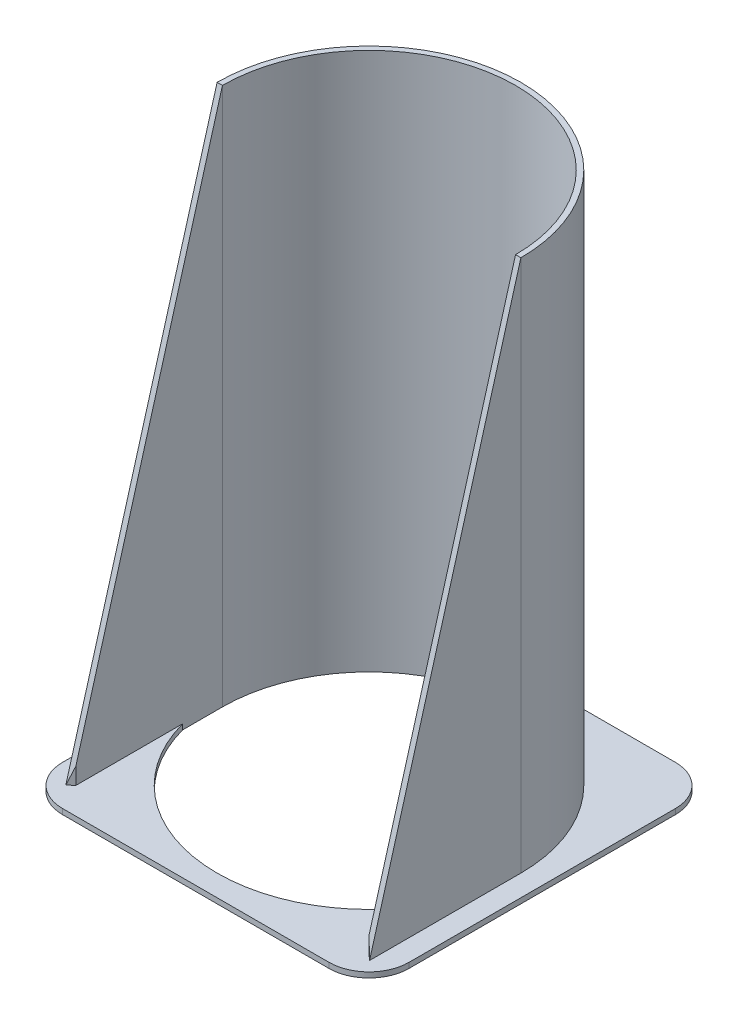
ISO-10303-21;
HEADER;
FILE_DESCRIPTION(('STEP AP214'),'2;1');
FILE_NAME('part.step','',(''),(''),'','','');
FILE_SCHEMA(('AUTOMOTIVE_DESIGN { 1 0 10303 214 1 1 1 1 }'));
ENDSEC;
DATA;
#1=APPLICATION_CONTEXT('core data for automotive mechanical design processes');
#2=APPLICATION_PROTOCOL_DEFINITION('international standard','automotive_design',2000,#1);
#3=PRODUCT_CONTEXT('',#1,'mechanical');
#4=PRODUCT('Part','Part','',(#3));
#5=PRODUCT_RELATED_PRODUCT_CATEGORY('part','',(#4));
#6=PRODUCT_DEFINITION_FORMATION('','',#4);
#7=PRODUCT_DEFINITION_CONTEXT('part definition',#1,'design');
#8=PRODUCT_DEFINITION('design','',#6,#7);
#9=PRODUCT_DEFINITION_SHAPE('','',#8);
#10=(LENGTH_UNIT() NAMED_UNIT(*) SI_UNIT(.MILLI.,.METRE.));
#11=(NAMED_UNIT(*) PLANE_ANGLE_UNIT() SI_UNIT($,.RADIAN.));
#12=(NAMED_UNIT(*) SI_UNIT($,.STERADIAN.) SOLID_ANGLE_UNIT());
#13=UNCERTAINTY_MEASURE_WITH_UNIT(LENGTH_MEASURE(1.E-05),#10,'distance_accuracy_value','');
#14=(GEOMETRIC_REPRESENTATION_CONTEXT(3) GLOBAL_UNCERTAINTY_ASSIGNED_CONTEXT((#13)) GLOBAL_UNIT_ASSIGNED_CONTEXT((#10,
#11,#12)) REPRESENTATION_CONTEXT('',''));
#15=CARTESIAN_POINT('',(0.,0.,0.));
#16=DIRECTION('',(0.,0.,1.));
#17=DIRECTION('',(1.,0.,0.));
#18=AXIS2_PLACEMENT_3D('',#15,#16,#17);
#19=CARTESIAN_POINT('',(47.5,1.,0.));
#20=DIRECTION('',(1.,0.,0.));
#21=DIRECTION('',(0.,0.,-1.));
#22=AXIS2_PLACEMENT_3D('',#19,#20,#21);
#23=PLANE('',#22);
#24=DIRECTION('',(0.,-1.,0.));
#25=VECTOR('',#24,1.);
#26=CARTESIAN_POINT('',(47.5,1.,-75.));
#27=LINE('',#26,#25);
#28=CARTESIAN_POINT('',(47.5,101.,-75.));
#29=VERTEX_POINT('',#28);
#30=CARTESIAN_POINT('',(47.5,0.,-75.));
#31=VERTEX_POINT('',#30);
#32=EDGE_CURVE('E250',#29,#31,#27,.T.);
#33=ORIENTED_EDGE('',*,*,#32,.F.);
#34=DIRECTION('',(0.,-0.961979500729469,0.273121658197005));
#35=VECTOR('',#34,1.);
#36=CARTESIAN_POINT('',(47.5,-11.2457637116788,-43.1315983477029));
#37=LINE('',#36,#35);
#38=CARTESIAN_POINT('',(47.5,4.14046698201226,-47.5));
#39=VERTEX_POINT('',#38);
#40=EDGE_CURVE('E174',#29,#39,#37,.T.);
#41=ORIENTED_EDGE('',*,*,#40,.T.);
#42=DIRECTION('',(0.,-1.,0.));
#43=VECTOR('',#42,1.);
#44=CARTESIAN_POINT('',(47.5,101.,-47.5));
#45=LINE('',#44,#43);
#46=CARTESIAN_POINT('',(47.5,1.,-47.5));
#47=VERTEX_POINT('',#46);
#48=EDGE_CURVE('E173',#39,#47,#45,.T.);
#49=ORIENTED_EDGE('',*,*,#48,.T.);
#50=DIRECTION('',(0.,0.,-1.));
#51=VECTOR('',#50,1.);
#52=CARTESIAN_POINT('',(47.5,1.,0.));
#53=LINE('',#52,#51);
#54=CARTESIAN_POINT('',(47.5,1.,-67.5166852264521));
#55=VERTEX_POINT('',#54);
#56=EDGE_CURVE('E184',#47,#55,#53,.T.);
#57=ORIENTED_EDGE('',*,*,#56,.T.);
#58=DIRECTION('',(0.,-1.,0.));
#59=VECTOR('',#58,1.);
#60=CARTESIAN_POINT('',(47.5,1.,-67.5166852264521));
#61=LINE('',#60,#59);
#62=CARTESIAN_POINT('',(47.5,0.,-67.5166852264521));
#63=VERTEX_POINT('',#62);
#64=EDGE_CURVE('E252',#55,#63,#61,.T.);
#65=ORIENTED_EDGE('',*,*,#64,.T.);
#66=DIRECTION('',(0.,0.,1.));
#67=VECTOR('',#66,1.);
#68=CARTESIAN_POINT('',(47.5,0.,0.));
#69=LINE('',#68,#67);
#70=EDGE_CURVE('E227',#31,#63,#69,.T.);
#71=ORIENTED_EDGE('',*,*,#70,.F.);
#72=EDGE_LOOP('',(#33,#41,#49,#57,#65,#71));
#73=FACE_BOUND('',#72,.T.);
#74=ADVANCED_FACE('F35',(#73),#23,.T.);
#75=CARTESIAN_POINT('',(102.5,1.,0.));
#76=DIRECTION('',(1.,0.,0.));
#77=DIRECTION('',(0.,0.,-1.));
#78=AXIS2_PLACEMENT_3D('',#75,#76,#77);
#79=PLANE('',#78);
#80=DIRECTION('',(0.,-0.961979500729469,0.273121658197005));
#81=VECTOR('',#80,1.);
#82=CARTESIAN_POINT('',(102.5,-11.2457637116788,-43.1315983477029));
#83=LINE('',#82,#81);
#84=CARTESIAN_POINT('',(102.5,101.,-75.));
#85=VERTEX_POINT('',#84);
#86=CARTESIAN_POINT('',(102.5,4.14046698201226,-47.5));
#87=VERTEX_POINT('',#86);
#88=EDGE_CURVE('E542',#85,#87,#83,.T.);
#89=ORIENTED_EDGE('',*,*,#88,.F.);
#90=DIRECTION('',(0.,-1.,0.));
#91=VECTOR('',#90,1.);
#92=CARTESIAN_POINT('',(102.5,1.,-75.));
#93=LINE('',#92,#91);
#94=CARTESIAN_POINT('',(102.5,0.,-75.));
#95=VERTEX_POINT('',#94);
#96=EDGE_CURVE('E248',#85,#95,#93,.T.);
#97=ORIENTED_EDGE('',*,*,#96,.T.);
#98=DIRECTION('',(0.,0.,1.));
#99=VECTOR('',#98,1.);
#100=CARTESIAN_POINT('',(102.5,0.,0.));
#101=LINE('',#100,#99);
#102=CARTESIAN_POINT('',(102.5,0.,-67.5166852264521));
#103=VERTEX_POINT('',#102);
#104=EDGE_CURVE('E233',#95,#103,#101,.T.);
#105=ORIENTED_EDGE('',*,*,#104,.T.);
#106=DIRECTION('',(0.,-1.,0.));
#107=VECTOR('',#106,1.);
#108=CARTESIAN_POINT('',(102.5,1.,-67.5166852264521));
#109=LINE('',#108,#107);
#110=CARTESIAN_POINT('',(102.5,1.,-67.5166852264521));
#111=VERTEX_POINT('',#110);
#112=EDGE_CURVE('E224',#111,#103,#109,.T.);
#113=ORIENTED_EDGE('',*,*,#112,.F.);
#114=DIRECTION('',(0.,0.,-1.));
#115=VECTOR('',#114,1.);
#116=CARTESIAN_POINT('',(102.5,1.,0.));
#117=LINE('',#116,#115);
#118=CARTESIAN_POINT('',(102.5,1.,-47.5));
#119=VERTEX_POINT('',#118);
#120=EDGE_CURVE('E552',#119,#111,#117,.T.);
#121=ORIENTED_EDGE('',*,*,#120,.F.);
#122=DIRECTION('',(0.,-1.,0.));
#123=VECTOR('',#122,1.);
#124=CARTESIAN_POINT('',(102.5,101.,-47.5));
#125=LINE('',#124,#123);
#126=EDGE_CURVE('E202',#87,#119,#125,.T.);
#127=ORIENTED_EDGE('',*,*,#126,.F.);
#128=EDGE_LOOP('',(#89,#97,#105,#113,#121,#127));
#129=FACE_BOUND('',#128,.T.);
#130=ADVANCED_FACE('F321',(#129),#79,.F.);
#131=CARTESIAN_POINT('',(68.9916629566608,101.,-77.3770304560326));
#132=DIRECTION('',(0.665505868663793,0.,-0.746392617041494));
#133=DIRECTION('',(-0.746392617041494,0.,-0.665505868663793));
#134=AXIS2_PLACEMENT_3D('',#131,#132,#133);
#135=PLANE('',#134);
#136=DIRECTION('',(0.292884648100951,-0.919794566899323,0.261144667970204));
#137=VECTOR('',#136,1.);
#138=CARTESIAN_POINT('',(71.2471060367351,102.289148565977,-75.3660102878854));
#139=LINE('',#138,#137);
#140=CARTESIAN_POINT('',(103.5,1.,-46.6083702417882));
#141=VERTEX_POINT('',#140);
#142=EDGE_CURVE('E553',#87,#141,#139,.T.);
#143=ORIENTED_EDGE('',*,*,#142,.F.);
#144=ORIENTED_EDGE('',*,*,#126,.T.);
#145=DIRECTION('',(0.746392617041494,0.,0.665505868663793));
#146=VECTOR('',#145,1.);
#147=CARTESIAN_POINT('',(68.9916629566608,1.,-77.3770304560326));
#148=LINE('',#147,#146);
#149=EDGE_CURVE('E198',#119,#141,#148,.T.);
#150=ORIENTED_EDGE('',*,*,#149,.T.);
#151=EDGE_LOOP('',(#143,#144,#150));
#152=FACE_BOUND('',#151,.T.);
#153=ADVANCED_FACE('F327',(#152),#135,.F.);
#154=CARTESIAN_POINT('',(103.5,101.,0.));
#155=DIRECTION('',(-1.,0.,0.));
#156=DIRECTION('',(0.,0.,1.));
#157=AXIS2_PLACEMENT_3D('',#154,#155,#156);
#158=PLANE('',#157);
#159=DIRECTION('',(0.,-0.961979500729469,0.273121658197005));
#160=VECTOR('',#159,1.);
#161=CARTESIAN_POINT('',(103.5,-12.1711682715025,-42.8688609113121));
#162=LINE('',#161,#160);
#163=CARTESIAN_POINT('',(103.5,101.,-75.));
#164=VERTEX_POINT('',#163);
#165=EDGE_CURVE('E175',#164,#141,#162,.T.);
#166=ORIENTED_EDGE('',*,*,#165,.T.);
#167=DIRECTION('',(0.,0.,-1.));
#168=VECTOR('',#167,1.);
#169=CARTESIAN_POINT('',(103.5,1.,0.));
#170=LINE('',#169,#168);
#171=CARTESIAN_POINT('',(103.5,1.,-75.));
#172=VERTEX_POINT('',#171);
#173=EDGE_CURVE('E192',#141,#172,#170,.T.);
#174=ORIENTED_EDGE('',*,*,#173,.T.);
#175=DIRECTION('',(0.,-1.,0.));
#176=VECTOR('',#175,1.);
#177=CARTESIAN_POINT('',(103.5,101.,-75.));
#178=LINE('',#177,#176);
#179=EDGE_CURVE('E205',#164,#172,#178,.T.);
#180=ORIENTED_EDGE('',*,*,#179,.F.);
#181=EDGE_LOOP('',(#166,#174,#180));
#182=FACE_BOUND('',#181,.T.);
#183=ADVANCED_FACE('F401',(#182),#158,.F.);
#184=CARTESIAN_POINT('',(46.5,101.,0.));
#185=DIRECTION('',(-1.,0.,0.));
#186=DIRECTION('',(0.,0.,1.));
#187=AXIS2_PLACEMENT_3D('',#184,#185,#186);
#188=PLANE('',#187);
#189=DIRECTION('',(0.,0.,-1.));
#190=VECTOR('',#189,1.);
#191=CARTESIAN_POINT('',(46.5,1.,0.));
#192=LINE('',#191,#190);
#193=CARTESIAN_POINT('',(46.5,1.,-46.6083702417882));
#194=VERTEX_POINT('',#193);
#195=CARTESIAN_POINT('',(46.5,1.,-75.));
#196=VERTEX_POINT('',#195);
#197=EDGE_CURVE('E181',#194,#196,#192,.T.);
#198=ORIENTED_EDGE('',*,*,#197,.F.);
#199=DIRECTION('',(0.,0.961979500729469,-0.273121658197005));
#200=VECTOR('',#199,1.);
#201=CARTESIAN_POINT('',(46.5,-12.1711682715025,-42.8688609113121));
#202=LINE('',#201,#200);
#203=CARTESIAN_POINT('',(46.5,101.,-75.));
#204=VERTEX_POINT('',#203);
#205=EDGE_CURVE('E154',#194,#204,#202,.T.);
#206=ORIENTED_EDGE('',*,*,#205,.T.);
#207=DIRECTION('',(0.,-1.,0.));
#208=VECTOR('',#207,1.);
#209=CARTESIAN_POINT('',(46.5,101.,-75.));
#210=LINE('',#209,#208);
#211=EDGE_CURVE('E188',#204,#196,#210,.T.);
#212=ORIENTED_EDGE('',*,*,#211,.T.);
#213=EDGE_LOOP('',(#198,#206,#212));
#214=FACE_BOUND('',#213,.T.);
#215=ADVANCED_FACE('F186',(#214),#188,.T.);
#216=CARTESIAN_POINT('',(-2.55695377276836,101.,-2.86773041076645));
#217=DIRECTION('',(0.665505868663793,0.,0.746392617041494));
#218=DIRECTION('',(0.746392617041494,0.,-0.665505868663793));
#219=AXIS2_PLACEMENT_3D('',#216,#217,#218);
#220=PLANE('',#219);
#221=ORIENTED_EDGE('',*,*,#48,.F.);
#222=DIRECTION('',(-0.292884648100951,-0.919794566899323,0.261144667970204));
#223=VECTOR('',#222,1.);
#224=CARTESIAN_POINT('',(65.8856813992822,61.8800923582555,-63.8932206606015));
#225=LINE('',#224,#223);
#226=EDGE_CURVE('E157',#39,#194,#225,.T.);
#227=ORIENTED_EDGE('',*,*,#226,.T.);
#228=DIRECTION('',(-0.746392617041494,0.,0.665505868663793));
#229=VECTOR('',#228,1.);
#230=CARTESIAN_POINT('',(-2.55695377276836,1.,-2.86773041076645));
#231=LINE('',#230,#229);
#232=EDGE_CURVE('E172',#47,#194,#231,.T.);
#233=ORIENTED_EDGE('',*,*,#232,.F.);
#234=EDGE_LOOP('',(#221,#227,#233));
#235=FACE_BOUND('',#234,.T.);
#236=ADVANCED_FACE('F171',(#235),#220,.T.);
#237=CARTESIAN_POINT('',(75.,101.,-75.));
#238=DIRECTION('',(0.,1.,0.));
#239=DIRECTION('',(0.,0.,1.));
#240=AXIS2_PLACEMENT_3D('',#237,#238,#239);
#241=PLANE('',#240);
#242=CARTESIAN_POINT('',(75.,101.,-75.));
#243=DIRECTION('',(0.,1.,0.));
#244=DIRECTION('',(0.,0.,1.));
#245=AXIS2_PLACEMENT_3D('',#242,#243,#244);
#246=CIRCLE('',#245,28.5);
#247=EDGE_CURVE('E210',#164,#204,#246,.T.);
#248=ORIENTED_EDGE('',*,*,#247,.T.);
#249=DIRECTION('',(1.,0.,0.));
#250=VECTOR('',#249,1.);
#251=CARTESIAN_POINT('',(75.,101.,-75.));
#252=LINE('',#251,#250);
#253=EDGE_CURVE('E160',#204,#29,#252,.T.);
#254=ORIENTED_EDGE('',*,*,#253,.T.);
#255=CARTESIAN_POINT('',(75.,101.,-75.));
#256=DIRECTION('',(0.,1.,0.));
#257=DIRECTION('',(0.,0.,1.));
#258=AXIS2_PLACEMENT_3D('',#255,#256,#257);
#259=CIRCLE('',#258,27.5);
#260=EDGE_CURVE('E201',#85,#29,#259,.T.);
#261=ORIENTED_EDGE('',*,*,#260,.F.);
#262=DIRECTION('',(-1.,0.,0.));
#263=VECTOR('',#262,1.);
#264=CARTESIAN_POINT('',(207.452319071425,101.,-75.));
#265=LINE('',#264,#263);
#266=EDGE_CURVE('E165',#164,#85,#265,.T.);
#267=ORIENTED_EDGE('',*,*,#266,.F.);
#268=EDGE_LOOP('',(#248,#254,#261,#267));
#269=FACE_BOUND('',#268,.T.);
#270=ADVANCED_FACE('F428',(#269),#241,.T.);
#271=CARTESIAN_POINT('',(0.,1.,0.));
#272=DIRECTION('',(0.,1.,0.));
#273=DIRECTION('',(0.,0.,1.));
#274=AXIS2_PLACEMENT_3D('',#271,#272,#273);
#275=PLANE('',#274);
#276=ORIENTED_EDGE('',*,*,#120,.T.);
#277=CARTESIAN_POINT('',(75.,1.,-75.));
#278=DIRECTION('',(0.,1.,0.));
#279=DIRECTION('',(0.,0.,1.));
#280=AXIS2_PLACEMENT_3D('',#277,#278,#279);
#281=CIRCLE('',#280,28.5);
#282=EDGE_CURVE('E211',#55,#111,#281,.T.);
#283=ORIENTED_EDGE('',*,*,#282,.F.);
#284=ORIENTED_EDGE('',*,*,#56,.F.);
#285=ORIENTED_EDGE('',*,*,#232,.T.);
#286=ORIENTED_EDGE('',*,*,#197,.T.);
#287=CARTESIAN_POINT('',(75.,1.,-75.));
#288=DIRECTION('',(0.,1.,0.));
#289=DIRECTION('',(0.,0.,1.));
#290=AXIS2_PLACEMENT_3D('',#287,#288,#289);
#291=CIRCLE('',#290,28.5);
#292=EDGE_CURVE('E190',#172,#196,#291,.T.);
#293=ORIENTED_EDGE('',*,*,#292,.F.);
#294=ORIENTED_EDGE('',*,*,#173,.F.);
#295=ORIENTED_EDGE('',*,*,#149,.F.);
#296=EDGE_LOOP('',(#276,#283,#284,#285,#286,#293,#294,#295));
#297=FACE_BOUND('',#296,.T.);
#298=DIRECTION('',(0.,0.,-1.));
#299=VECTOR('',#298,1.);
#300=CARTESIAN_POINT('',(42.5,1.,0.));
#301=LINE('',#300,#299);
#302=CARTESIAN_POINT('',(42.5,1.,-50.));
#303=VERTEX_POINT('',#302);
#304=CARTESIAN_POINT('',(42.5,1.,-100.));
#305=VERTEX_POINT('',#304);
#306=EDGE_CURVE('E221',#303,#305,#301,.T.);
#307=ORIENTED_EDGE('',*,*,#306,.F.);
#308=CARTESIAN_POINT('',(50.,1.,-50.));
#309=DIRECTION('',(0.,1.,0.));
#310=DIRECTION('',(0.,0.,1.));
#311=AXIS2_PLACEMENT_3D('',#308,#309,#310);
#312=CIRCLE('',#311,7.5);
#313=CARTESIAN_POINT('',(50.,1.,-42.5));
#314=VERTEX_POINT('',#313);
#315=EDGE_CURVE('E278',#303,#314,#312,.T.);
#316=ORIENTED_EDGE('',*,*,#315,.T.);
#317=DIRECTION('',(1.,0.,0.));
#318=VECTOR('',#317,1.);
#319=CARTESIAN_POINT('',(0.,1.,-42.5));
#320=LINE('',#319,#318);
#321=CARTESIAN_POINT('',(100.,1.,-42.5));
#322=VERTEX_POINT('',#321);
#323=EDGE_CURVE('E213',#314,#322,#320,.T.);
#324=ORIENTED_EDGE('',*,*,#323,.T.);
#325=CARTESIAN_POINT('',(100.,1.,-50.));
#326=DIRECTION('',(0.,1.,0.));
#327=DIRECTION('',(0.,0.,1.));
#328=AXIS2_PLACEMENT_3D('',#325,#326,#327);
#329=CIRCLE('',#328,7.5);
#330=CARTESIAN_POINT('',(107.5,1.,-50.));
#331=VERTEX_POINT('',#330);
#332=EDGE_CURVE('E273',#322,#331,#329,.T.);
#333=ORIENTED_EDGE('',*,*,#332,.T.);
#334=DIRECTION('',(0.,0.,-1.));
#335=VECTOR('',#334,1.);
#336=CARTESIAN_POINT('',(107.5,1.,0.));
#337=LINE('',#336,#335);
#338=CARTESIAN_POINT('',(107.5,1.,-100.));
#339=VERTEX_POINT('',#338);
#340=EDGE_CURVE('E217',#331,#339,#337,.T.);
#341=ORIENTED_EDGE('',*,*,#340,.T.);
#342=CARTESIAN_POINT('',(100.,1.,-100.));
#343=DIRECTION('',(0.,1.,0.));
#344=DIRECTION('',(0.,0.,1.));
#345=AXIS2_PLACEMENT_3D('',#342,#343,#344);
#346=CIRCLE('',#345,7.5);
#347=CARTESIAN_POINT('',(100.,1.,-107.5));
#348=VERTEX_POINT('',#347);
#349=EDGE_CURVE('E50',#339,#348,#346,.T.);
#350=ORIENTED_EDGE('',*,*,#349,.T.);
#351=DIRECTION('',(1.,0.,0.));
#352=VECTOR('',#351,1.);
#353=CARTESIAN_POINT('',(0.,1.,-107.5));
#354=LINE('',#353,#352);
#355=CARTESIAN_POINT('',(50.,1.,-107.5));
#356=VERTEX_POINT('',#355);
#357=EDGE_CURVE('E219',#356,#348,#354,.T.);
#358=ORIENTED_EDGE('',*,*,#357,.F.);
#359=CARTESIAN_POINT('',(50.,1.,-100.));
#360=DIRECTION('',(0.,1.,0.));
#361=DIRECTION('',(0.,0.,1.));
#362=AXIS2_PLACEMENT_3D('',#359,#360,#361);
#363=CIRCLE('',#362,7.5);
#364=EDGE_CURVE('E276',#356,#305,#363,.T.);
#365=ORIENTED_EDGE('',*,*,#364,.T.);
#366=EDGE_LOOP('',(#307,#316,#324,#333,#341,#350,#358,#365));
#367=FACE_BOUND('',#366,.T.);
#368=ADVANCED_FACE('F180',(#297,#367),#275,.T.);
#369=CARTESIAN_POINT('',(0.,1.,-42.5));
#370=DIRECTION('',(0.,0.,-1.));
#371=DIRECTION('',(-1.,0.,0.));
#372=AXIS2_PLACEMENT_3D('',#369,#370,#371);
#373=PLANE('',#372);
#374=ORIENTED_EDGE('',*,*,#323,.F.);
#375=DIRECTION('',(0.,-1.,0.));
#376=VECTOR('',#375,1.);
#377=CARTESIAN_POINT('',(50.,0.,-42.5));
#378=LINE('',#377,#376);
#379=CARTESIAN_POINT('',(50.,0.,-42.5));
#380=VERTEX_POINT('',#379);
#381=EDGE_CURVE('E257',#314,#380,#378,.T.);
#382=ORIENTED_EDGE('',*,*,#381,.T.);
#383=DIRECTION('',(1.,0.,0.));
#384=VECTOR('',#383,1.);
#385=CARTESIAN_POINT('',(0.,0.,-42.5));
#386=LINE('',#385,#384);
#387=CARTESIAN_POINT('',(100.,0.,-42.5));
#388=VERTEX_POINT('',#387);
#389=EDGE_CURVE('E236',#380,#388,#386,.T.);
#390=ORIENTED_EDGE('',*,*,#389,.T.);
#391=DIRECTION('',(0.,-1.,0.));
#392=VECTOR('',#391,1.);
#393=CARTESIAN_POINT('',(100.,1.,-42.5));
#394=LINE('',#393,#392);
#395=EDGE_CURVE('E255',#388,#322,#394,.F.);
#396=ORIENTED_EDGE('',*,*,#395,.T.);
#397=EDGE_LOOP('',(#374,#382,#390,#396));
#398=FACE_BOUND('',#397,.T.);
#399=ADVANCED_FACE('F314',(#398),#373,.F.);
#400=CARTESIAN_POINT('',(107.5,1.,0.));
#401=DIRECTION('',(-1.,0.,0.));
#402=DIRECTION('',(0.,0.,1.));
#403=AXIS2_PLACEMENT_3D('',#400,#401,#402);
#404=PLANE('',#403);
#405=DIRECTION('',(0.,0.,-1.));
#406=VECTOR('',#405,1.);
#407=CARTESIAN_POINT('',(107.5,0.,0.));
#408=LINE('',#407,#406);
#409=CARTESIAN_POINT('',(107.5,0.,-50.));
#410=VERTEX_POINT('',#409);
#411=CARTESIAN_POINT('',(107.5,0.,-100.));
#412=VERTEX_POINT('',#411);
#413=EDGE_CURVE('E239',#410,#412,#408,.T.);
#414=ORIENTED_EDGE('',*,*,#413,.T.);
#415=DIRECTION('',(0.,-1.,0.));
#416=VECTOR('',#415,1.);
#417=CARTESIAN_POINT('',(107.5,1.,-100.));
#418=LINE('',#417,#416);
#419=EDGE_CURVE('E11',#412,#339,#418,.F.);
#420=ORIENTED_EDGE('',*,*,#419,.T.);
#421=ORIENTED_EDGE('',*,*,#340,.F.);
#422=DIRECTION('',(0.,-1.,0.));
#423=VECTOR('',#422,1.);
#424=CARTESIAN_POINT('',(107.5,1.,-50.));
#425=LINE('',#424,#423);
#426=EDGE_CURVE('E43',#331,#410,#425,.T.);
#427=ORIENTED_EDGE('',*,*,#426,.T.);
#428=EDGE_LOOP('',(#414,#420,#421,#427));
#429=FACE_BOUND('',#428,.T.);
#430=ADVANCED_FACE('F288',(#429),#404,.F.);
#431=CARTESIAN_POINT('',(0.,1.,-107.5));
#432=DIRECTION('',(0.,0.,-1.));
#433=DIRECTION('',(-1.,0.,0.));
#434=AXIS2_PLACEMENT_3D('',#431,#432,#433);
#435=PLANE('',#434);
#436=DIRECTION('',(1.,0.,0.));
#437=VECTOR('',#436,1.);
#438=CARTESIAN_POINT('',(0.,0.,-107.5));
#439=LINE('',#438,#437);
#440=CARTESIAN_POINT('',(50.,0.,-107.5));
#441=VERTEX_POINT('',#440);
#442=CARTESIAN_POINT('',(100.,0.,-107.5));
#443=VERTEX_POINT('',#442);
#444=EDGE_CURVE('E242',#441,#443,#439,.T.);
#445=ORIENTED_EDGE('',*,*,#444,.F.);
#446=DIRECTION('',(0.,-1.,0.));
#447=VECTOR('',#446,1.);
#448=CARTESIAN_POINT('',(50.,1.,-107.5));
#449=LINE('',#448,#447);
#450=EDGE_CURVE('E57',#441,#356,#449,.F.);
#451=ORIENTED_EDGE('',*,*,#450,.T.);
#452=ORIENTED_EDGE('',*,*,#357,.T.);
#453=DIRECTION('',(0.,-1.,0.));
#454=VECTOR('',#453,1.);
#455=CARTESIAN_POINT('',(100.,0.,-107.5));
#456=LINE('',#455,#454);
#457=EDGE_CURVE('E280',#348,#443,#456,.T.);
#458=ORIENTED_EDGE('',*,*,#457,.T.);
#459=EDGE_LOOP('',(#445,#451,#452,#458));
#460=FACE_BOUND('',#459,.T.);
#461=ADVANCED_FACE('F298',(#460),#435,.T.);
#462=CARTESIAN_POINT('',(75.,1.,-75.));
#463=DIRECTION('',(0.,-1.,0.));
#464=DIRECTION('',(0.,0.,-1.));
#465=AXIS2_PLACEMENT_3D('',#462,#463,#464);
#466=CYLINDRICAL_SURFACE('',#465,28.5);
#467=CARTESIAN_POINT('',(75.,0.,-75.));
#468=DIRECTION('',(0.,1.,0.));
#469=DIRECTION('',(0.,0.,1.));
#470=AXIS2_PLACEMENT_3D('',#467,#468,#469);
#471=CIRCLE('',#470,28.5);
#472=EDGE_CURVE('E204',#63,#103,#471,.T.);
#473=ORIENTED_EDGE('',*,*,#472,.F.);
#474=ORIENTED_EDGE('',*,*,#64,.F.);
#475=ORIENTED_EDGE('',*,*,#282,.T.);
#476=ORIENTED_EDGE('',*,*,#112,.T.);
#477=EDGE_LOOP('',(#473,#474,#475,#476));
#478=FACE_BOUND('',#477,.T.);
#479=ADVANCED_FACE('F334',(#478),#466,.F.);
#480=CARTESIAN_POINT('',(75.,1.,-75.));
#481=DIRECTION('',(0.,-1.,0.));
#482=DIRECTION('',(0.,0.,-1.));
#483=AXIS2_PLACEMENT_3D('',#480,#481,#482);
#484=CYLINDRICAL_SURFACE('',#483,27.5);
#485=CARTESIAN_POINT('',(75.,0.,-75.));
#486=DIRECTION('',(0.,1.,0.));
#487=DIRECTION('',(0.,0.,1.));
#488=AXIS2_PLACEMENT_3D('',#485,#486,#487);
#489=CIRCLE('',#488,27.5);
#490=EDGE_CURVE('E230',#95,#31,#489,.T.);
#491=ORIENTED_EDGE('',*,*,#490,.F.);
#492=ORIENTED_EDGE('',*,*,#96,.F.);
#493=ORIENTED_EDGE('',*,*,#260,.T.);
#494=ORIENTED_EDGE('',*,*,#32,.T.);
#495=EDGE_LOOP('',(#491,#492,#493,#494));
#496=FACE_BOUND('',#495,.T.);
#497=ADVANCED_FACE('F333',(#496),#484,.F.);
#498=CARTESIAN_POINT('',(42.5,1.,0.));
#499=DIRECTION('',(-1.,0.,0.));
#500=DIRECTION('',(0.,0.,1.));
#501=AXIS2_PLACEMENT_3D('',#498,#499,#500);
#502=PLANE('',#501);
#503=DIRECTION('',(0.,0.,-1.));
#504=VECTOR('',#503,1.);
#505=CARTESIAN_POINT('',(42.5,0.,0.));
#506=LINE('',#505,#504);
#507=CARTESIAN_POINT('',(42.5,0.,-50.));
#508=VERTEX_POINT('',#507);
#509=CARTESIAN_POINT('',(42.5,0.,-100.));
#510=VERTEX_POINT('',#509);
#511=EDGE_CURVE('E214',#508,#510,#506,.T.);
#512=ORIENTED_EDGE('',*,*,#511,.F.);
#513=DIRECTION('',(0.,-1.,0.));
#514=VECTOR('',#513,1.);
#515=CARTESIAN_POINT('',(42.5,1.,-50.));
#516=LINE('',#515,#514);
#517=EDGE_CURVE('E271',#508,#303,#516,.F.);
#518=ORIENTED_EDGE('',*,*,#517,.T.);
#519=ORIENTED_EDGE('',*,*,#306,.T.);
#520=DIRECTION('',(0.,-1.,0.));
#521=VECTOR('',#520,1.);
#522=CARTESIAN_POINT('',(42.5,1.,-100.));
#523=LINE('',#522,#521);
#524=EDGE_CURVE('E268',#305,#510,#523,.T.);
#525=ORIENTED_EDGE('',*,*,#524,.T.);
#526=EDGE_LOOP('',(#512,#518,#519,#525));
#527=FACE_BOUND('',#526,.T.);
#528=ADVANCED_FACE('F306',(#527),#502,.T.);
#529=CARTESIAN_POINT('',(0.,0.,0.));
#530=DIRECTION('',(0.,1.,0.));
#531=DIRECTION('',(0.,0.,1.));
#532=AXIS2_PLACEMENT_3D('',#529,#530,#531);
#533=PLANE('',#532);
#534=ORIENTED_EDGE('',*,*,#472,.T.);
#535=ORIENTED_EDGE('',*,*,#104,.F.);
#536=ORIENTED_EDGE('',*,*,#490,.T.);
#537=ORIENTED_EDGE('',*,*,#70,.T.);
#538=EDGE_LOOP('',(#534,#535,#536,#537));
#539=FACE_BOUND('',#538,.T.);
#540=ORIENTED_EDGE('',*,*,#389,.F.);
#541=CARTESIAN_POINT('',(50.,0.,-50.));
#542=DIRECTION('',(0.,1.,0.));
#543=DIRECTION('',(0.,0.,1.));
#544=AXIS2_PLACEMENT_3D('',#541,#542,#543);
#545=CIRCLE('',#544,7.5);
#546=EDGE_CURVE('E266',#380,#508,#545,.F.);
#547=ORIENTED_EDGE('',*,*,#546,.T.);
#548=ORIENTED_EDGE('',*,*,#511,.T.);
#549=CARTESIAN_POINT('',(50.,0.,-100.));
#550=DIRECTION('',(0.,1.,0.));
#551=DIRECTION('',(0.,0.,1.));
#552=AXIS2_PLACEMENT_3D('',#549,#550,#551);
#553=CIRCLE('',#552,7.5);
#554=EDGE_CURVE('E264',#510,#441,#553,.F.);
#555=ORIENTED_EDGE('',*,*,#554,.T.);
#556=ORIENTED_EDGE('',*,*,#444,.T.);
#557=CARTESIAN_POINT('',(100.,0.,-100.));
#558=DIRECTION('',(0.,1.,0.));
#559=DIRECTION('',(0.,0.,1.));
#560=AXIS2_PLACEMENT_3D('',#557,#558,#559);
#561=CIRCLE('',#560,7.5);
#562=EDGE_CURVE('E262',#443,#412,#561,.F.);
#563=ORIENTED_EDGE('',*,*,#562,.T.);
#564=ORIENTED_EDGE('',*,*,#413,.F.);
#565=CARTESIAN_POINT('',(100.,0.,-50.));
#566=DIRECTION('',(0.,1.,0.));
#567=DIRECTION('',(0.,0.,1.));
#568=AXIS2_PLACEMENT_3D('',#565,#566,#567);
#569=CIRCLE('',#568,7.5);
#570=EDGE_CURVE('E260',#410,#388,#569,.F.);
#571=ORIENTED_EDGE('',*,*,#570,.T.);
#572=EDGE_LOOP('',(#540,#547,#548,#555,#556,#563,#564,#571));
#573=FACE_BOUND('',#572,.T.);
#574=ADVANCED_FACE('F294',(#539,#573),#533,.F.);
#575=CARTESIAN_POINT('',(75.,101.,-75.));
#576=DIRECTION('',(0.,-1.,0.));
#577=DIRECTION('',(0.,0.,-1.));
#578=AXIS2_PLACEMENT_3D('',#575,#576,#577);
#579=CYLINDRICAL_SURFACE('',#578,28.5);
#580=ORIENTED_EDGE('',*,*,#292,.T.);
#581=ORIENTED_EDGE('',*,*,#211,.F.);
#582=ORIENTED_EDGE('',*,*,#247,.F.);
#583=ORIENTED_EDGE('',*,*,#179,.T.);
#584=EDGE_LOOP('',(#580,#581,#582,#583));
#585=FACE_BOUND('',#584,.T.);
#586=ADVANCED_FACE('F379',(#585),#579,.T.);
#587=CARTESIAN_POINT('',(207.452319071425,-12.1711682715025,-42.8688609113121));
#588=DIRECTION('',(0.,0.273121658197005,0.961979500729469));
#589=DIRECTION('',(0.,-0.961979500729469,0.273121658197005));
#590=AXIS2_PLACEMENT_3D('',#587,#588,#589);
#591=PLANE('',#590);
#592=ORIENTED_EDGE('',*,*,#88,.T.);
#593=ORIENTED_EDGE('',*,*,#142,.T.);
#594=ORIENTED_EDGE('',*,*,#165,.F.);
#595=ORIENTED_EDGE('',*,*,#266,.T.);
#596=EDGE_LOOP('',(#592,#593,#594,#595));
#597=FACE_BOUND('',#596,.T.);
#598=ADVANCED_FACE('F370',(#597),#591,.T.);
#599=ORIENTED_EDGE('',*,*,#253,.F.);
#600=ORIENTED_EDGE('',*,*,#205,.F.);
#601=ORIENTED_EDGE('',*,*,#226,.F.);
#602=ORIENTED_EDGE('',*,*,#40,.F.);
#603=EDGE_LOOP('',(#599,#600,#601,#602));
#604=FACE_BOUND('',#603,.T.);
#605=ADVANCED_FACE('F156',(#604),#591,.T.);
#606=CARTESIAN_POINT('',(50.,1.,-50.));
#607=DIRECTION('',(0.,1.,0.));
#608=DIRECTION('',(0.,0.,1.));
#609=AXIS2_PLACEMENT_3D('',#606,#607,#608);
#610=CYLINDRICAL_SURFACE('',#609,7.5);
#611=ORIENTED_EDGE('',*,*,#315,.F.);
#612=ORIENTED_EDGE('',*,*,#517,.F.);
#613=ORIENTED_EDGE('',*,*,#546,.F.);
#614=ORIENTED_EDGE('',*,*,#381,.F.);
#615=EDGE_LOOP('',(#611,#612,#613,#614));
#616=FACE_BOUND('',#615,.T.);
#617=ADVANCED_FACE('F311',(#616),#610,.T.);
#618=CARTESIAN_POINT('',(50.,1.,-100.));
#619=DIRECTION('',(0.,-1.,0.));
#620=DIRECTION('',(0.,0.,-1.));
#621=AXIS2_PLACEMENT_3D('',#618,#619,#620);
#622=CYLINDRICAL_SURFACE('',#621,7.5);
#623=ORIENTED_EDGE('',*,*,#364,.F.);
#624=ORIENTED_EDGE('',*,*,#450,.F.);
#625=ORIENTED_EDGE('',*,*,#554,.F.);
#626=ORIENTED_EDGE('',*,*,#524,.F.);
#627=EDGE_LOOP('',(#623,#624,#625,#626));
#628=FACE_BOUND('',#627,.T.);
#629=ADVANCED_FACE('F303',(#628),#622,.T.);
#630=CARTESIAN_POINT('',(100.,1.,-100.));
#631=DIRECTION('',(0.,1.,0.));
#632=DIRECTION('',(0.,0.,1.));
#633=AXIS2_PLACEMENT_3D('',#630,#631,#632);
#634=CYLINDRICAL_SURFACE('',#633,7.5);
#635=ORIENTED_EDGE('',*,*,#349,.F.);
#636=ORIENTED_EDGE('',*,*,#419,.F.);
#637=ORIENTED_EDGE('',*,*,#562,.F.);
#638=ORIENTED_EDGE('',*,*,#457,.F.);
#639=EDGE_LOOP('',(#635,#636,#637,#638));
#640=FACE_BOUND('',#639,.T.);
#641=ADVANCED_FACE('F297',(#640),#634,.T.);
#642=CARTESIAN_POINT('',(100.,1.,-50.));
#643=DIRECTION('',(0.,-1.,0.));
#644=DIRECTION('',(0.,0.,-1.));
#645=AXIS2_PLACEMENT_3D('',#642,#643,#644);
#646=CYLINDRICAL_SURFACE('',#645,7.5);
#647=ORIENTED_EDGE('',*,*,#332,.F.);
#648=ORIENTED_EDGE('',*,*,#395,.F.);
#649=ORIENTED_EDGE('',*,*,#570,.F.);
#650=ORIENTED_EDGE('',*,*,#426,.F.);
#651=EDGE_LOOP('',(#647,#648,#649,#650));
#652=FACE_BOUND('',#651,.T.);
#653=ADVANCED_FACE('F37',(#652),#646,.T.);
#654=CLOSED_SHELL('',(#74,#130,#153,#183,#215,#236,#270,#368,#399,#430,#461,#479,#497,#528,#574,
#586,#598,#605,#617,#629,#641,#653));
#655=MANIFOLD_SOLID_BREP('B2',#654);
#656=ADVANCED_BREP_SHAPE_REPRESENTATION('',(#18,#655),#14);
#657=SHAPE_DEFINITION_REPRESENTATION(#9,#656);
ENDSEC;
END-ISO-10303-21;
